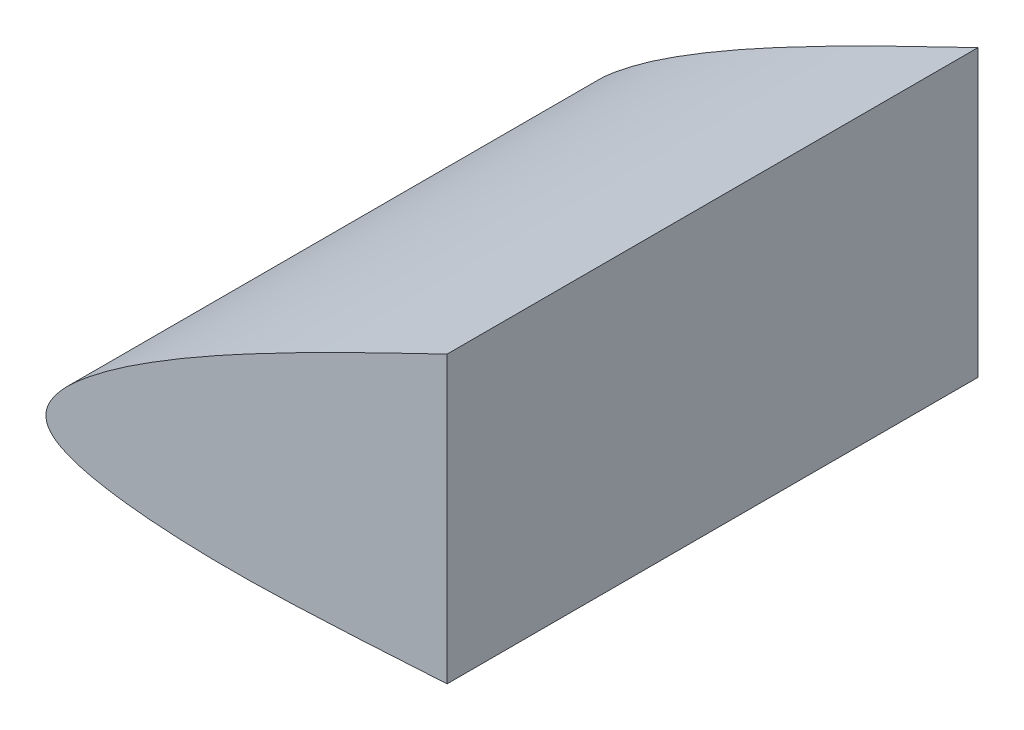
ISO-10303-21;
HEADER;
FILE_DESCRIPTION(('STEP AP214'),'2;1');
FILE_NAME('part.step','',(''),(''),'','','');
FILE_SCHEMA(('AUTOMOTIVE_DESIGN { 1 0 10303 214 1 1 1 1 }'));
ENDSEC;
DATA;
#1=APPLICATION_CONTEXT('core data for automotive mechanical design processes');
#2=APPLICATION_PROTOCOL_DEFINITION('international standard','automotive_design',2000,#1);
#3=PRODUCT_CONTEXT('',#1,'mechanical');
#4=PRODUCT('Part','Part','',(#3));
#5=PRODUCT_RELATED_PRODUCT_CATEGORY('part','',(#4));
#6=PRODUCT_DEFINITION_FORMATION('','',#4);
#7=PRODUCT_DEFINITION_CONTEXT('part definition',#1,'design');
#8=PRODUCT_DEFINITION('design','',#6,#7);
#9=PRODUCT_DEFINITION_SHAPE('','',#8);
#10=(LENGTH_UNIT() NAMED_UNIT(*) SI_UNIT(.MILLI.,.METRE.));
#11=(NAMED_UNIT(*) PLANE_ANGLE_UNIT() SI_UNIT($,.RADIAN.));
#12=(NAMED_UNIT(*) SI_UNIT($,.STERADIAN.) SOLID_ANGLE_UNIT());
#13=UNCERTAINTY_MEASURE_WITH_UNIT(LENGTH_MEASURE(1.E-05),#10,'distance_accuracy_value','');
#14=(GEOMETRIC_REPRESENTATION_CONTEXT(3) GLOBAL_UNCERTAINTY_ASSIGNED_CONTEXT((#13)) GLOBAL_UNIT_ASSIGNED_CONTEXT((#10,
#11,#12)) REPRESENTATION_CONTEXT('',''));
#15=CARTESIAN_POINT('',(0.,0.,0.));
#16=DIRECTION('',(0.,0.,1.));
#17=DIRECTION('',(1.,0.,0.));
#18=AXIS2_PLACEMENT_3D('',#15,#16,#17);
#19=CARTESIAN_POINT('',(-69.7868257790885,-119.734126049081,51.9999999999997));
#20=CARTESIAN_POINT('',(-70.7988284380486,-120.222900698055,51.9999999999997));
#21=CARTESIAN_POINT('',(-71.8121629426785,-120.710603283311,51.9999999999997));
#22=CARTESIAN_POINT('',(-73.2968291636603,-121.504860657459,51.9999999999997));
#23=CARTESIAN_POINT('',(-73.7856282144859,-121.780447733752,51.9999999999997));
#24=CARTESIAN_POINT('',(-74.4982378415108,-122.230459674747,51.9999999999997));
#25=CARTESIAN_POINT('',(-74.7332587541613,-122.386373541555,51.9999999999997));
#26=CARTESIAN_POINT('',(-75.0721594365273,-122.639451787176,51.9999999999997));
#27=CARTESIAN_POINT('',(-75.1830929765848,-122.726162111209,51.9999999999997));
#28=CARTESIAN_POINT('',(-75.398315592283,-122.907264908845,51.9999999999997));
#29=CARTESIAN_POINT('',(-75.502207690036,-123.002116357515,51.9999999999997));
#30=CARTESIAN_POINT('',(-75.6431581997498,-123.161606212585,51.9999999999997));
#31=CARTESIAN_POINT('',(-75.6878990365528,-123.217507156513,51.9999999999997));
#32=CARTESIAN_POINT('',(-75.7663937066998,-123.335416700854,51.9999999999997));
#33=CARTESIAN_POINT('',(-75.8013815645168,-123.399175386805,51.9999999999997));
#34=CARTESIAN_POINT('',(-75.837727284276,-123.537106932623,51.9999999999997));
#35=CARTESIAN_POINT('',(-75.8346784481774,-123.613912751497,51.9999999999997));
#36=CARTESIAN_POINT('',(-75.7693669956541,-123.741100015385,51.9999999999997));
#37=CARTESIAN_POINT('',(-75.7126695057223,-123.790158288948,51.9999999999997));
#38=CARTESIAN_POINT('',(-75.5919882421925,-123.866836767176,51.9999999999997));
#39=CARTESIAN_POINT('',(-75.5258378021159,-123.896083681141,51.9999999999997));
#40=CARTESIAN_POINT('',(-75.3926384182853,-123.946121739959,51.9999999999997));
#41=CARTESIAN_POINT('',(-75.3248118740059,-123.96685324598,51.9999999999997));
#42=CARTESIAN_POINT('',(-75.1190464472058,-124.021059520825,51.9999999999997));
#43=CARTESIAN_POINT('',(-74.9784871729416,-124.047215680617,51.9999999999997));
#44=CARTESIAN_POINT('',(-74.5577564078957,-124.112007986119,51.9999999999997));
#45=CARTESIAN_POINT('',(-74.2772064871226,-124.136283198398,51.9999999999997));
#46=CARTESIAN_POINT('',(-73.7160574893149,-124.170011193014,51.9999999999997));
#47=CARTESIAN_POINT('',(-73.4354546448143,-124.178327945069,51.9999999999997));
#48=CARTESIAN_POINT('',(-72.5935786933344,-124.182949189086,51.9999999999997));
#49=CARTESIAN_POINT('',(-72.0322380913951,-124.158901455654,51.9999999999997));
#50=CARTESIAN_POINT('',(-70.9095366971242,-124.104717839196,51.9999999999997));
#51=CARTESIAN_POINT('',(-70.3481067402076,-124.072504896411,51.9999999999997));
#52=CARTESIAN_POINT('',(-69.7868257790748,-124.037453095073,51.9999999999997));
#53=B_SPLINE_CURVE_WITH_KNOTS('',3,(#19,#20,#21,#22,#23,#24,#25,#26,#27,#28,#29,#30,#31,#32,#33,
#34,#35,#36,#37,#38,#39,#40,#41,#42,#43,#44,#45,#46,#47,#48,#49,#50,#51,#52),.UNSPECIFIED.,.F.,
.F.,(4,2,2,2,2,2,2,2,2,2,2,2,2,2,2,2,4),(0.,0.249999999999989,0.374999999999983,
0.437499999999982,0.468749999999981,0.499999999999981,0.515624999999982,0.531249999999983,
0.546874999999984,0.562499999999985,0.578124999999985,0.593749999999986,0.624999999999987,
0.68749999999999,0.749999999999992,0.874999999999996,1.),.UNSPECIFIED.);
#54=DIRECTION('',(0.,0.,-1.));
#55=VECTOR('',#54,1.);
#56=SURFACE_OF_LINEAR_EXTRUSION('',#53,#55);
#57=CARTESIAN_POINT('',(-69.7868257790885,-119.734126049081,43.9999999999997));
#58=CARTESIAN_POINT('',(-70.7988284380486,-120.222900698055,43.9999999999997));
#59=CARTESIAN_POINT('',(-71.8121629426785,-120.710603283311,43.9999999999997));
#60=CARTESIAN_POINT('',(-73.2968291636603,-121.504860657459,43.9999999999997));
#61=CARTESIAN_POINT('',(-73.7856282144859,-121.780447733752,43.9999999999997));
#62=CARTESIAN_POINT('',(-74.4982378415108,-122.230459674747,43.9999999999997));
#63=CARTESIAN_POINT('',(-74.7332587541613,-122.386373541555,43.9999999999997));
#64=CARTESIAN_POINT('',(-75.0721594365273,-122.639451787176,43.9999999999997));
#65=CARTESIAN_POINT('',(-75.1830929765848,-122.726162111209,43.9999999999997));
#66=CARTESIAN_POINT('',(-75.398315592283,-122.907264908845,43.9999999999997));
#67=CARTESIAN_POINT('',(-75.502207690036,-123.002116357515,43.9999999999997));
#68=CARTESIAN_POINT('',(-75.6431581997498,-123.161606212585,43.9999999999997));
#69=CARTESIAN_POINT('',(-75.6878990365528,-123.217507156513,43.9999999999997));
#70=CARTESIAN_POINT('',(-75.7663937066998,-123.335416700854,43.9999999999997));
#71=CARTESIAN_POINT('',(-75.8013815645168,-123.399175386805,43.9999999999997));
#72=CARTESIAN_POINT('',(-75.837727284276,-123.537106932623,43.9999999999997));
#73=CARTESIAN_POINT('',(-75.8346784481774,-123.613912751497,43.9999999999997));
#74=CARTESIAN_POINT('',(-75.7693669956541,-123.741100015385,43.9999999999997));
#75=CARTESIAN_POINT('',(-75.7126695057223,-123.790158288948,43.9999999999997));
#76=CARTESIAN_POINT('',(-75.5919882421925,-123.866836767176,43.9999999999997));
#77=CARTESIAN_POINT('',(-75.5258378021159,-123.896083681141,43.9999999999997));
#78=CARTESIAN_POINT('',(-75.3926384182853,-123.946121739959,43.9999999999997));
#79=CARTESIAN_POINT('',(-75.3248118740059,-123.96685324598,43.9999999999997));
#80=CARTESIAN_POINT('',(-75.1190464472058,-124.021059520825,43.9999999999997));
#81=CARTESIAN_POINT('',(-74.9784871729416,-124.047215680617,43.9999999999997));
#82=CARTESIAN_POINT('',(-74.5577564078957,-124.112007986119,43.9999999999997));
#83=CARTESIAN_POINT('',(-74.2772064871226,-124.136283198398,43.9999999999997));
#84=CARTESIAN_POINT('',(-73.7160574893149,-124.170011193014,43.9999999999997));
#85=CARTESIAN_POINT('',(-73.4354546448143,-124.178327945069,43.9999999999997));
#86=CARTESIAN_POINT('',(-72.5935786933344,-124.182949189086,43.9999999999997));
#87=CARTESIAN_POINT('',(-72.0322380913951,-124.158901455654,43.9999999999997));
#88=CARTESIAN_POINT('',(-70.9095366971242,-124.104717839196,43.9999999999997));
#89=CARTESIAN_POINT('',(-70.3481067402076,-124.072504896411,43.9999999999997));
#90=CARTESIAN_POINT('',(-69.7868257790748,-124.037453095073,43.9999999999997));
#91=B_SPLINE_CURVE_WITH_KNOTS('',3,(#57,#58,#59,#60,#61,#62,#63,#64,#65,#66,#67,#68,#69,#70,#71,
#72,#73,#74,#75,#76,#77,#78,#79,#80,#81,#82,#83,#84,#85,#86,#87,#88,#89,#90),.UNSPECIFIED.,.F.,
.F.,(4,2,2,2,2,2,2,2,2,2,2,2,2,2,2,2,4),(0.,0.249999999999989,0.374999999999983,
0.437499999999982,0.468749999999981,0.499999999999981,0.515624999999982,0.531249999999983,
0.546874999999984,0.562499999999985,0.578124999999985,0.593749999999986,0.624999999999987,
0.68749999999999,0.749999999999992,0.874999999999996,1.),.UNSPECIFIED.);
#92=CARTESIAN_POINT('',(-69.7868257790818,-119.734126049087,43.9999999999997));
#93=VERTEX_POINT('',#92);
#94=CARTESIAN_POINT('',(-69.7868257790751,-124.037453095073,43.9999999999997));
#95=VERTEX_POINT('',#94);
#96=EDGE_CURVE('E65',#93,#95,#91,.T.);
#97=ORIENTED_EDGE('',*,*,#96,.T.);
#98=DIRECTION('',(0.,0.,-1.));
#99=VECTOR('',#98,1.);
#100=CARTESIAN_POINT('',(-69.7868257790751,-124.037453095073,51.9999999999997));
#101=LINE('',#100,#99);
#102=CARTESIAN_POINT('',(-69.7868257790751,-124.037453095073,51.9999999999997));
#103=VERTEX_POINT('',#102);
#104=EDGE_CURVE('E11',#103,#95,#101,.T.);
#105=ORIENTED_EDGE('',*,*,#104,.F.);
#106=CARTESIAN_POINT('',(-69.7868257790748,-124.037453095073,51.9999999999997));
#107=CARTESIAN_POINT('',(-70.3481067402076,-124.072504896411,51.9999999999997));
#108=CARTESIAN_POINT('',(-70.9095366971242,-124.104717839196,51.9999999999997));
#109=CARTESIAN_POINT('',(-72.0322380913951,-124.158901455654,51.9999999999997));
#110=CARTESIAN_POINT('',(-72.5935786933344,-124.182949189086,51.9999999999997));
#111=CARTESIAN_POINT('',(-73.4354546448143,-124.178327945069,51.9999999999997));
#112=CARTESIAN_POINT('',(-73.7160574893149,-124.170011193014,51.9999999999997));
#113=CARTESIAN_POINT('',(-74.2772064871226,-124.136283198398,51.9999999999997));
#114=CARTESIAN_POINT('',(-74.5577564078957,-124.112007986119,51.9999999999997));
#115=CARTESIAN_POINT('',(-74.9784871729416,-124.047215680617,51.9999999999997));
#116=CARTESIAN_POINT('',(-75.1190464472058,-124.021059520825,51.9999999999997));
#117=CARTESIAN_POINT('',(-75.3248118740059,-123.96685324598,51.9999999999997));
#118=CARTESIAN_POINT('',(-75.3926384182853,-123.946121739959,51.9999999999997));
#119=CARTESIAN_POINT('',(-75.5258378021159,-123.896083681141,51.9999999999997));
#120=CARTESIAN_POINT('',(-75.5919882421925,-123.866836767176,51.9999999999997));
#121=CARTESIAN_POINT('',(-75.7126695057223,-123.790158288948,51.9999999999997));
#122=CARTESIAN_POINT('',(-75.7693669956541,-123.741100015385,51.9999999999997));
#123=CARTESIAN_POINT('',(-75.8346784481774,-123.613912751497,51.9999999999997));
#124=CARTESIAN_POINT('',(-75.837727284276,-123.537106932623,51.9999999999997));
#125=CARTESIAN_POINT('',(-75.8013815645168,-123.399175386805,51.9999999999997));
#126=CARTESIAN_POINT('',(-75.7663937066998,-123.335416700854,51.9999999999997));
#127=CARTESIAN_POINT('',(-75.6878990365528,-123.217507156513,51.9999999999997));
#128=CARTESIAN_POINT('',(-75.6431581997498,-123.161606212585,51.9999999999997));
#129=CARTESIAN_POINT('',(-75.502207690036,-123.002116357515,51.9999999999997));
#130=CARTESIAN_POINT('',(-75.398315592283,-122.907264908845,51.9999999999997));
#131=CARTESIAN_POINT('',(-75.1830929765848,-122.726162111209,51.9999999999997));
#132=CARTESIAN_POINT('',(-75.0721594365273,-122.639451787176,51.9999999999997));
#133=CARTESIAN_POINT('',(-74.7332587541613,-122.386373541555,51.9999999999997));
#134=CARTESIAN_POINT('',(-74.4982378415108,-122.230459674747,51.9999999999997));
#135=CARTESIAN_POINT('',(-73.7856282144859,-121.780447733752,51.9999999999997));
#136=CARTESIAN_POINT('',(-73.2968291636603,-121.504860657459,51.9999999999997));
#137=CARTESIAN_POINT('',(-71.8121629426785,-120.710603283311,51.9999999999997));
#138=CARTESIAN_POINT('',(-70.7988284380486,-120.222900698055,51.9999999999997));
#139=CARTESIAN_POINT('',(-69.7868257790885,-119.734126049081,51.9999999999997));
#140=B_SPLINE_CURVE_WITH_KNOTS('',3,(#106,#107,#108,#109,#110,#111,#112,#113,#114,#115,#116,
#117,#118,#119,#120,#121,#122,#123,#124,#125,#126,#127,#128,#129,#130,#131,#132,#133,#134,#135,
#136,#137,#138,#139),.UNSPECIFIED.,.F.,.F.,(4,2,2,2,2,2,2,2,2,2,2,2,2,2,2,2,4),(0.,
0.125000000000004,0.250000000000008,0.31250000000001,0.375000000000013,0.406250000000014,
0.421875000000015,0.437500000000015,0.453125000000016,0.468750000000017,0.484375000000018,
0.500000000000019,0.531250000000019,0.562500000000018,0.625000000000017,0.750000000000011,1.),.UNSPECIFIED.);
#141=CARTESIAN_POINT('',(-69.7868257790818,-119.734126049087,51.9999999999997));
#142=VERTEX_POINT('',#141);
#143=EDGE_CURVE('E64',#142,#103,#140,.F.);
#144=ORIENTED_EDGE('',*,*,#143,.F.);
#145=DIRECTION('',(0.,0.,-1.));
#146=VECTOR('',#145,1.);
#147=CARTESIAN_POINT('',(-69.7868257790818,-119.734126049087,51.9999999999997));
#148=LINE('',#147,#146);
#149=EDGE_CURVE('E41',#142,#93,#148,.T.);
#150=ORIENTED_EDGE('',*,*,#149,.T.);
#151=EDGE_LOOP('',(#97,#105,#144,#150));
#152=FACE_BOUND('',#151,.T.);
#153=ADVANCED_FACE('F30',(#152),#56,.F.);
#154=CARTESIAN_POINT('',(-69.7868257790818,-119.734126049087,51.9999999999997));
#155=DIRECTION('',(-1.,-1.55440050265409E-12,0.));
#156=DIRECTION('',(1.55440050265409E-12,-1.,0.));
#157=AXIS2_PLACEMENT_3D('',#154,#155,#156);
#158=PLANE('',#157);
#159=DIRECTION('',(-1.55440050265409E-12,1.,0.));
#160=VECTOR('',#159,1.);
#161=CARTESIAN_POINT('',(-69.7868257790818,-119.734126049087,43.9999999999997));
#162=LINE('',#161,#160);
#163=EDGE_CURVE('E57',#95,#93,#162,.T.);
#164=ORIENTED_EDGE('',*,*,#163,.T.);
#165=ORIENTED_EDGE('',*,*,#149,.F.);
#166=DIRECTION('',(-1.55440050265409E-12,1.,0.));
#167=VECTOR('',#166,1.);
#168=CARTESIAN_POINT('',(-69.7868257790818,-119.734126049087,51.9999999999997));
#169=LINE('',#168,#167);
#170=EDGE_CURVE('E49',#103,#142,#169,.T.);
#171=ORIENTED_EDGE('',*,*,#170,.F.);
#172=ORIENTED_EDGE('',*,*,#104,.T.);
#173=EDGE_LOOP('',(#164,#165,#171,#172));
#174=FACE_BOUND('',#173,.T.);
#175=ADVANCED_FACE('F60',(#174),#158,.F.);
#176=CARTESIAN_POINT('',(-75.596174696512,-123.108442927562,51.9999999999997));
#177=DIRECTION('',(0.,0.,1.));
#178=DIRECTION('',(1.,0.,0.));
#179=AXIS2_PLACEMENT_3D('',#176,#177,#178);
#180=PLANE('',#179);
#181=ORIENTED_EDGE('',*,*,#143,.T.);
#182=ORIENTED_EDGE('',*,*,#170,.T.);
#183=EDGE_LOOP('',(#181,#182));
#184=FACE_BOUND('',#183,.T.);
#185=ADVANCED_FACE('F87',(#184),#180,.T.);
#186=CARTESIAN_POINT('',(-75.596174696512,-123.108442927562,43.9999999999997));
#187=DIRECTION('',(0.,0.,1.));
#188=DIRECTION('',(1.,0.,0.));
#189=AXIS2_PLACEMENT_3D('',#186,#187,#188);
#190=PLANE('',#189);
#191=ORIENTED_EDGE('',*,*,#96,.F.);
#192=ORIENTED_EDGE('',*,*,#163,.F.);
#193=EDGE_LOOP('',(#191,#192));
#194=FACE_BOUND('',#193,.T.);
#195=ADVANCED_FACE('F71',(#194),#190,.F.);
#196=CLOSED_SHELL('',(#153,#175,#185,#195));
#197=MANIFOLD_SOLID_BREP('B2',#196);
#198=ADVANCED_BREP_SHAPE_REPRESENTATION('',(#18,#197),#14);
#199=SHAPE_DEFINITION_REPRESENTATION(#9,#198);
ENDSEC;
END-ISO-10303-21;
